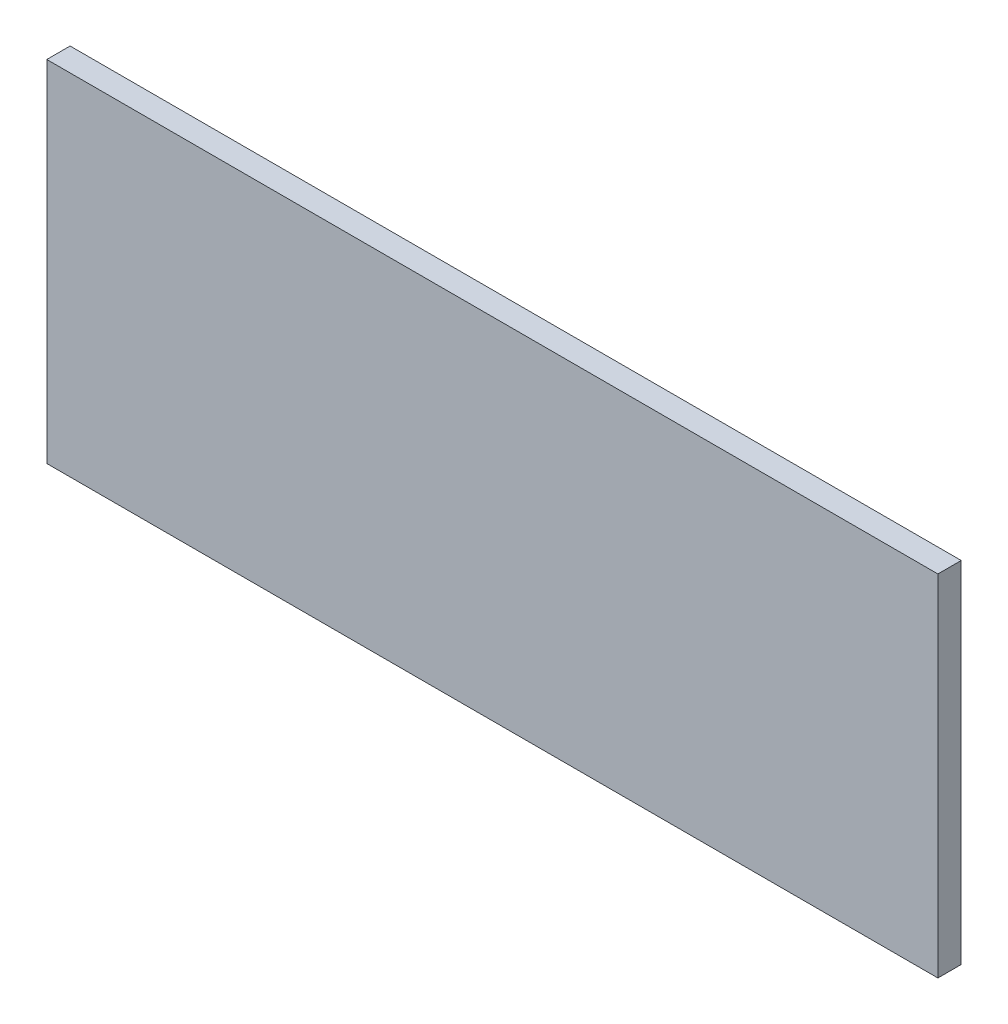
ISO-10303-21;
HEADER;
FILE_DESCRIPTION(('STEP AP214'),'2;1');
FILE_NAME('part.step','',(''),(''),'','','');
FILE_SCHEMA(('AUTOMOTIVE_DESIGN { 1 0 10303 214 1 1 1 1 }'));
ENDSEC;
DATA;
#1=APPLICATION_CONTEXT('core data for automotive mechanical design processes');
#2=APPLICATION_PROTOCOL_DEFINITION('international standard','automotive_design',2000,#1);
#3=PRODUCT_CONTEXT('',#1,'mechanical');
#4=PRODUCT('Part','Part','',(#3));
#5=PRODUCT_RELATED_PRODUCT_CATEGORY('part','',(#4));
#6=PRODUCT_DEFINITION_FORMATION('','',#4);
#7=PRODUCT_DEFINITION_CONTEXT('part definition',#1,'design');
#8=PRODUCT_DEFINITION('design','',#6,#7);
#9=PRODUCT_DEFINITION_SHAPE('','',#8);
#10=(LENGTH_UNIT() NAMED_UNIT(*) SI_UNIT(.MILLI.,.METRE.));
#11=(NAMED_UNIT(*) PLANE_ANGLE_UNIT() SI_UNIT($,.RADIAN.));
#12=(NAMED_UNIT(*) SI_UNIT($,.STERADIAN.) SOLID_ANGLE_UNIT());
#13=UNCERTAINTY_MEASURE_WITH_UNIT(LENGTH_MEASURE(1.E-05),#10,'distance_accuracy_value','');
#14=(GEOMETRIC_REPRESENTATION_CONTEXT(3) GLOBAL_UNCERTAINTY_ASSIGNED_CONTEXT((#13)) GLOBAL_UNIT_ASSIGNED_CONTEXT((#10,
#11,#12)) REPRESENTATION_CONTEXT('',''));
#15=CARTESIAN_POINT('',(0.,0.,0.));
#16=DIRECTION('',(0.,0.,1.));
#17=DIRECTION('',(1.,0.,0.));
#18=AXIS2_PLACEMENT_3D('',#15,#16,#17);
#19=CARTESIAN_POINT('',(191.,75.,10.));
#20=DIRECTION('',(-1.,0.,0.));
#21=DIRECTION('',(0.,0.,1.));
#22=AXIS2_PLACEMENT_3D('',#19,#20,#21);
#23=PLANE('',#22);
#24=DIRECTION('',(0.,1.,0.));
#25=VECTOR('',#24,1.);
#26=CARTESIAN_POINT('',(191.,75.,0.));
#27=LINE('',#26,#25);
#28=CARTESIAN_POINT('',(191.,-75.,0.));
#29=VERTEX_POINT('',#28);
#30=CARTESIAN_POINT('',(191.,75.,0.));
#31=VERTEX_POINT('',#30);
#32=EDGE_CURVE('E102',#29,#31,#27,.T.);
#33=ORIENTED_EDGE('',*,*,#32,.T.);
#34=DIRECTION('',(0.,0.,-1.));
#35=VECTOR('',#34,1.);
#36=CARTESIAN_POINT('',(191.,75.,10.));
#37=LINE('',#36,#35);
#38=CARTESIAN_POINT('',(191.,75.,10.));
#39=VERTEX_POINT('',#38);
#40=EDGE_CURVE('E11',#39,#31,#37,.T.);
#41=ORIENTED_EDGE('',*,*,#40,.F.);
#42=DIRECTION('',(0.,1.,0.));
#43=VECTOR('',#42,1.);
#44=CARTESIAN_POINT('',(191.,75.,10.));
#45=LINE('',#44,#43);
#46=CARTESIAN_POINT('',(191.,-75.,10.));
#47=VERTEX_POINT('',#46);
#48=EDGE_CURVE('E90',#47,#39,#45,.T.);
#49=ORIENTED_EDGE('',*,*,#48,.F.);
#50=DIRECTION('',(0.,0.,-1.));
#51=VECTOR('',#50,1.);
#52=CARTESIAN_POINT('',(191.,-75.,10.));
#53=LINE('',#52,#51);
#54=EDGE_CURVE('E98',#47,#29,#53,.T.);
#55=ORIENTED_EDGE('',*,*,#54,.T.);
#56=EDGE_LOOP('',(#33,#41,#49,#55));
#57=FACE_BOUND('',#56,.T.);
#58=ADVANCED_FACE('F39',(#57),#23,.F.);
#59=CARTESIAN_POINT('',(-191.,75.,10.));
#60=DIRECTION('',(0.,-1.,0.));
#61=DIRECTION('',(0.,0.,-1.));
#62=AXIS2_PLACEMENT_3D('',#59,#60,#61);
#63=PLANE('',#62);
#64=DIRECTION('',(-1.,0.,0.));
#65=VECTOR('',#64,1.);
#66=CARTESIAN_POINT('',(-191.,75.,0.));
#67=LINE('',#66,#65);
#68=CARTESIAN_POINT('',(-191.,75.,0.));
#69=VERTEX_POINT('',#68);
#70=EDGE_CURVE('E94',#31,#69,#67,.T.);
#71=ORIENTED_EDGE('',*,*,#70,.T.);
#72=DIRECTION('',(0.,0.,-1.));
#73=VECTOR('',#72,1.);
#74=CARTESIAN_POINT('',(-191.,75.,10.));
#75=LINE('',#74,#73);
#76=CARTESIAN_POINT('',(-191.,75.,10.));
#77=VERTEX_POINT('',#76);
#78=EDGE_CURVE('E47',#77,#69,#75,.T.);
#79=ORIENTED_EDGE('',*,*,#78,.F.);
#80=DIRECTION('',(-1.,0.,0.));
#81=VECTOR('',#80,1.);
#82=CARTESIAN_POINT('',(-191.,75.,10.));
#83=LINE('',#82,#81);
#84=EDGE_CURVE('E85',#39,#77,#83,.T.);
#85=ORIENTED_EDGE('',*,*,#84,.F.);
#86=ORIENTED_EDGE('',*,*,#40,.T.);
#87=EDGE_LOOP('',(#71,#79,#85,#86));
#88=FACE_BOUND('',#87,.T.);
#89=ADVANCED_FACE('F93',(#88),#63,.F.);
#90=CARTESIAN_POINT('',(-191.,75.,10.));
#91=DIRECTION('',(1.,0.,0.));
#92=DIRECTION('',(0.,1.,0.));
#93=AXIS2_PLACEMENT_3D('',#90,#91,#92);
#94=PLANE('',#93);
#95=DIRECTION('',(0.,-1.,0.));
#96=VECTOR('',#95,1.);
#97=CARTESIAN_POINT('',(-191.,75.,0.));
#98=LINE('',#97,#96);
#99=CARTESIAN_POINT('',(-191.,-75.,0.));
#100=VERTEX_POINT('',#99);
#101=EDGE_CURVE('E72',#69,#100,#98,.T.);
#102=ORIENTED_EDGE('',*,*,#101,.T.);
#103=DIRECTION('',(0.,0.,-1.));
#104=VECTOR('',#103,1.);
#105=CARTESIAN_POINT('',(-191.,-75.,10.));
#106=LINE('',#105,#104);
#107=CARTESIAN_POINT('',(-191.,-75.,10.));
#108=VERTEX_POINT('',#107);
#109=EDGE_CURVE('E95',#108,#100,#106,.T.);
#110=ORIENTED_EDGE('',*,*,#109,.F.);
#111=DIRECTION('',(0.,-1.,0.));
#112=VECTOR('',#111,1.);
#113=CARTESIAN_POINT('',(-191.,75.,10.));
#114=LINE('',#113,#112);
#115=EDGE_CURVE('E88',#77,#108,#114,.T.);
#116=ORIENTED_EDGE('',*,*,#115,.F.);
#117=ORIENTED_EDGE('',*,*,#78,.T.);
#118=EDGE_LOOP('',(#102,#110,#116,#117));
#119=FACE_BOUND('',#118,.T.);
#120=ADVANCED_FACE('F96',(#119),#94,.F.);
#121=CARTESIAN_POINT('',(-191.,-75.,10.));
#122=DIRECTION('',(0.,1.,0.));
#123=DIRECTION('',(0.,0.,1.));
#124=AXIS2_PLACEMENT_3D('',#121,#122,#123);
#125=PLANE('',#124);
#126=DIRECTION('',(1.,0.,0.));
#127=VECTOR('',#126,1.);
#128=CARTESIAN_POINT('',(-191.,-75.,0.));
#129=LINE('',#128,#127);
#130=EDGE_CURVE('E78',#100,#29,#129,.T.);
#131=ORIENTED_EDGE('',*,*,#130,.T.);
#132=ORIENTED_EDGE('',*,*,#54,.F.);
#133=DIRECTION('',(1.,0.,0.));
#134=VECTOR('',#133,1.);
#135=CARTESIAN_POINT('',(-191.,-75.,10.));
#136=LINE('',#135,#134);
#137=EDGE_CURVE('E55',#108,#47,#136,.T.);
#138=ORIENTED_EDGE('',*,*,#137,.F.);
#139=ORIENTED_EDGE('',*,*,#109,.T.);
#140=EDGE_LOOP('',(#131,#132,#138,#139));
#141=FACE_BOUND('',#140,.T.);
#142=ADVANCED_FACE('F109',(#141),#125,.F.);
#143=CARTESIAN_POINT('',(0.,0.,10.));
#144=DIRECTION('',(0.,0.,1.));
#145=DIRECTION('',(1.,0.,0.));
#146=AXIS2_PLACEMENT_3D('',#143,#144,#145);
#147=PLANE('',#146);
#148=ORIENTED_EDGE('',*,*,#48,.T.);
#149=ORIENTED_EDGE('',*,*,#84,.T.);
#150=ORIENTED_EDGE('',*,*,#115,.T.);
#151=ORIENTED_EDGE('',*,*,#137,.T.);
#152=EDGE_LOOP('',(#148,#149,#150,#151));
#153=FACE_BOUND('',#152,.T.);
#154=ADVANCED_FACE('F86',(#153),#147,.T.);
#155=CARTESIAN_POINT('',(0.,0.,0.));
#156=DIRECTION('',(0.,0.,1.));
#157=DIRECTION('',(1.,0.,0.));
#158=AXIS2_PLACEMENT_3D('',#155,#156,#157);
#159=PLANE('',#158);
#160=ORIENTED_EDGE('',*,*,#32,.F.);
#161=ORIENTED_EDGE('',*,*,#130,.F.);
#162=ORIENTED_EDGE('',*,*,#101,.F.);
#163=ORIENTED_EDGE('',*,*,#70,.F.);
#164=EDGE_LOOP('',(#160,#161,#162,#163));
#165=FACE_BOUND('',#164,.T.);
#166=ADVANCED_FACE('F112',(#165),#159,.F.);
#167=CLOSED_SHELL('',(#58,#89,#120,#142,#154,#166));
#168=MANIFOLD_SOLID_BREP('B2',#167);
#169=ADVANCED_BREP_SHAPE_REPRESENTATION('',(#18,#168),#14);
#170=SHAPE_DEFINITION_REPRESENTATION(#9,#169);
ENDSEC;
END-ISO-10303-21;
